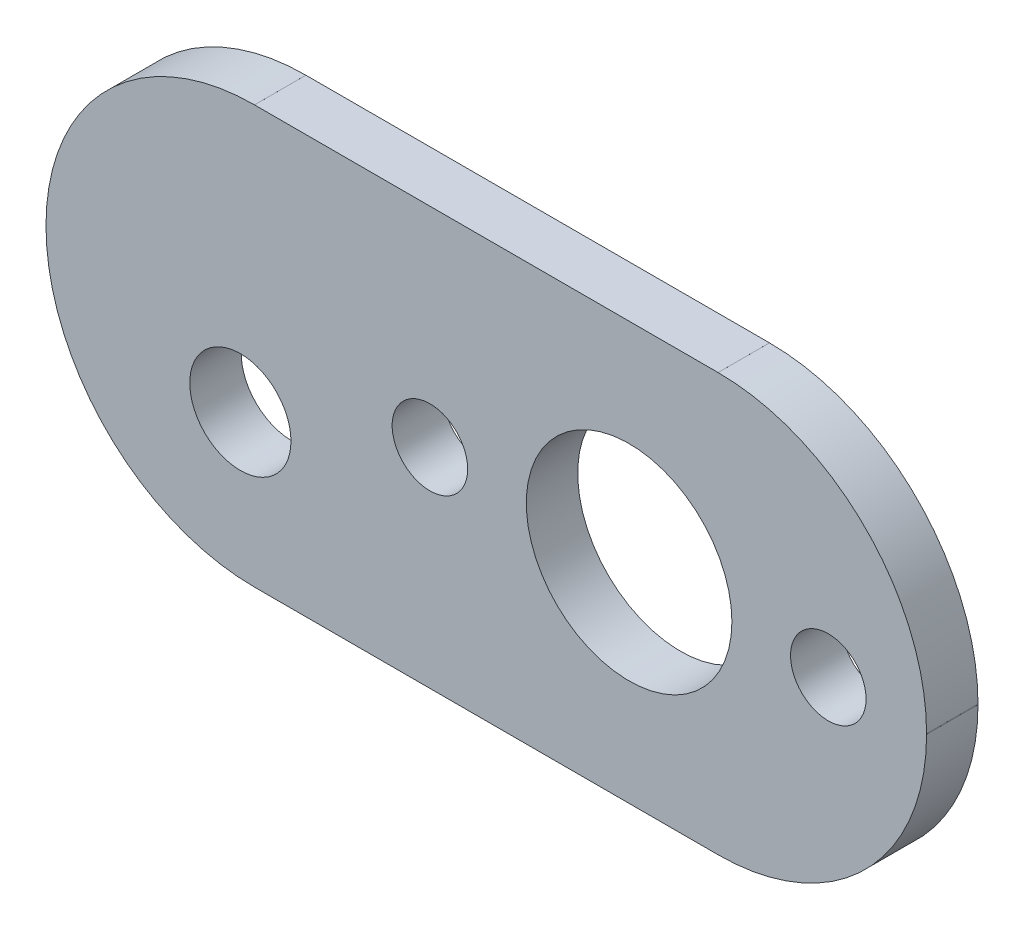
ISO-10303-21;
HEADER;
FILE_DESCRIPTION(('STEP AP214'),'2;1');
FILE_NAME('part.step','',(''),(''),'','','');
FILE_SCHEMA(('AUTOMOTIVE_DESIGN { 1 0 10303 214 1 1 1 1 }'));
ENDSEC;
DATA;
#1=APPLICATION_CONTEXT('core data for automotive mechanical design processes');
#2=APPLICATION_PROTOCOL_DEFINITION('international standard','automotive_design',2000,#1);
#3=PRODUCT_CONTEXT('',#1,'mechanical');
#4=PRODUCT('Part','Part','',(#3));
#5=PRODUCT_RELATED_PRODUCT_CATEGORY('part','',(#4));
#6=PRODUCT_DEFINITION_FORMATION('','',#4);
#7=PRODUCT_DEFINITION_CONTEXT('part definition',#1,'design');
#8=PRODUCT_DEFINITION('design','',#6,#7);
#9=PRODUCT_DEFINITION_SHAPE('','',#8);
#10=(LENGTH_UNIT() NAMED_UNIT(*) SI_UNIT(.MILLI.,.METRE.));
#11=(NAMED_UNIT(*) PLANE_ANGLE_UNIT() SI_UNIT($,.RADIAN.));
#12=(NAMED_UNIT(*) SI_UNIT($,.STERADIAN.) SOLID_ANGLE_UNIT());
#13=UNCERTAINTY_MEASURE_WITH_UNIT(LENGTH_MEASURE(1.E-05),#10,'distance_accuracy_value','');
#14=(GEOMETRIC_REPRESENTATION_CONTEXT(3) GLOBAL_UNCERTAINTY_ASSIGNED_CONTEXT((#13)) GLOBAL_UNIT_ASSIGNED_CONTEXT((#10,
#11,#12)) REPRESENTATION_CONTEXT('',''));
#15=CARTESIAN_POINT('',(0.,0.,0.));
#16=DIRECTION('',(0.,0.,1.));
#17=DIRECTION('',(1.,0.,0.));
#18=AXIS2_PLACEMENT_3D('',#15,#16,#17);
#19=CARTESIAN_POINT('',(-11.66,-6.5,1.6));
#20=DIRECTION('',(0.,0.,-1.));
#21=DIRECTION('',(-1.,0.,0.));
#22=AXIS2_PLACEMENT_3D('',#19,#20,#21);
#23=CYLINDRICAL_SURFACE('',#22,0.000300000000000387);
#24=CARTESIAN_POINT('',(-11.66,-6.5,0.));
#25=DIRECTION('',(0.,0.,1.));
#26=DIRECTION('',(1.,0.,0.));
#27=AXIS2_PLACEMENT_3D('',#24,#25,#26);
#28=CIRCLE('',#27,0.000300000000000387);
#29=CARTESIAN_POINT('',(-11.6597,-6.5,0.));
#30=VERTEX_POINT('',#29);
#31=CARTESIAN_POINT('',(-11.6603000000028,-6.49999998612066,0.));
#32=VERTEX_POINT('',#31);
#33=EDGE_CURVE('E204',#30,#32,#28,.T.);
#34=ORIENTED_EDGE('',*,*,#33,.F.);
#35=DIRECTION('',(0.,0.,-1.));
#36=VECTOR('',#35,1.);
#37=CARTESIAN_POINT('',(-11.6597,-6.5,1.6));
#38=LINE('',#37,#36);
#39=CARTESIAN_POINT('',(-11.6597,-6.5,1.6));
#40=VERTEX_POINT('',#39);
#41=EDGE_CURVE('E11',#40,#30,#38,.T.);
#42=ORIENTED_EDGE('',*,*,#41,.F.);
#43=CARTESIAN_POINT('',(-11.66,-6.5,1.6));
#44=DIRECTION('',(0.,0.,1.));
#45=DIRECTION('',(1.,0.,0.));
#46=AXIS2_PLACEMENT_3D('',#43,#44,#45);
#47=CIRCLE('',#46,0.000300000000000387);
#48=CARTESIAN_POINT('',(-11.6603000000028,-6.49999998612066,1.6));
#49=VERTEX_POINT('',#48);
#50=EDGE_CURVE('E334',#40,#49,#47,.T.);
#51=ORIENTED_EDGE('',*,*,#50,.T.);
#52=DIRECTION('',(0.,0.,-1.));
#53=VECTOR('',#52,1.);
#54=CARTESIAN_POINT('',(-11.6603000000028,-6.49999998612066,1.6));
#55=LINE('',#54,#53);
#56=EDGE_CURVE('E116',#49,#32,#55,.T.);
#57=ORIENTED_EDGE('',*,*,#56,.T.);
#58=EDGE_LOOP('',(#34,#42,#51,#57));
#59=FACE_BOUND('',#58,.T.);
#60=ADVANCED_FACE('F40',(#59),#23,.F.);
#61=CARTESIAN_POINT('',(0.,-6.5,1.6));
#62=DIRECTION('',(0.,1.,0.));
#63=DIRECTION('',(0.,0.,1.));
#64=AXIS2_PLACEMENT_3D('',#61,#62,#63);
#65=PLANE('',#64);
#66=DIRECTION('',(1.,0.,0.));
#67=VECTOR('',#66,1.);
#68=CARTESIAN_POINT('',(0.,-6.5,0.));
#69=LINE('',#68,#67);
#70=CARTESIAN_POINT('',(2.7697,-6.5,0.));
#71=VERTEX_POINT('',#70);
#72=EDGE_CURVE('E208',#30,#71,#69,.T.);
#73=ORIENTED_EDGE('',*,*,#72,.T.);
#74=DIRECTION('',(0.,0.,-1.));
#75=VECTOR('',#74,1.);
#76=CARTESIAN_POINT('',(2.7697,-6.5,1.6));
#77=LINE('',#76,#75);
#78=CARTESIAN_POINT('',(2.7697,-6.5,1.6));
#79=VERTEX_POINT('',#78);
#80=EDGE_CURVE('E50',#79,#71,#77,.T.);
#81=ORIENTED_EDGE('',*,*,#80,.F.);
#82=DIRECTION('',(1.,0.,0.));
#83=VECTOR('',#82,1.);
#84=CARTESIAN_POINT('',(0.,-6.5,1.6));
#85=LINE('',#84,#83);
#86=EDGE_CURVE('E330',#40,#79,#85,.T.);
#87=ORIENTED_EDGE('',*,*,#86,.F.);
#88=ORIENTED_EDGE('',*,*,#41,.T.);
#89=EDGE_LOOP('',(#73,#81,#87,#88));
#90=FACE_BOUND('',#89,.T.);
#91=ADVANCED_FACE('F314',(#90),#65,.F.);
#92=CARTESIAN_POINT('',(2.77,-6.5,1.6));
#93=DIRECTION('',(0.,0.,-1.));
#94=DIRECTION('',(-1.,0.,0.));
#95=AXIS2_PLACEMENT_3D('',#92,#93,#94);
#96=CYLINDRICAL_SURFACE('',#95,0.000300000000000387);
#97=CARTESIAN_POINT('',(2.77,-6.5,0.));
#98=DIRECTION('',(0.,0.,1.));
#99=DIRECTION('',(1.,0.,0.));
#100=AXIS2_PLACEMENT_3D('',#97,#98,#99);
#101=CIRCLE('',#100,0.000300000000000387);
#102=CARTESIAN_POINT('',(2.77030000000277,-6.49999998612066,0.));
#103=VERTEX_POINT('',#102);
#104=EDGE_CURVE('E212',#103,#71,#101,.T.);
#105=ORIENTED_EDGE('',*,*,#104,.F.);
#106=DIRECTION('',(0.,0.,-1.));
#107=VECTOR('',#106,1.);
#108=CARTESIAN_POINT('',(2.77030000000277,-6.49999998612066,1.6));
#109=LINE('',#108,#107);
#110=CARTESIAN_POINT('',(2.77030000000277,-6.49999998612066,1.6));
#111=VERTEX_POINT('',#110);
#112=EDGE_CURVE('E302',#111,#103,#109,.T.);
#113=ORIENTED_EDGE('',*,*,#112,.F.);
#114=CARTESIAN_POINT('',(2.77,-6.5,1.6));
#115=DIRECTION('',(0.,0.,1.));
#116=DIRECTION('',(1.,0.,0.));
#117=AXIS2_PLACEMENT_3D('',#114,#115,#116);
#118=CIRCLE('',#117,0.000300000000000387);
#119=EDGE_CURVE('E311',#111,#79,#118,.T.);
#120=ORIENTED_EDGE('',*,*,#119,.T.);
#121=ORIENTED_EDGE('',*,*,#80,.T.);
#122=EDGE_LOOP('',(#105,#113,#120,#121));
#123=FACE_BOUND('',#122,.T.);
#124=ADVANCED_FACE('F309',(#123),#96,.F.);
#125=CARTESIAN_POINT('',(2.76984973660068,-0.0098497366006773,1.6));
#126=DIRECTION('',(0.,0.,-1.));
#127=DIRECTION('',(-1.,0.,0.));
#128=AXIS2_PLACEMENT_3D('',#125,#126,#127);
#129=CYLINDRICAL_SURFACE('',#128,6.49015026513881);
#130=CARTESIAN_POINT('',(2.76984973660068,-0.0098497366006773,0.));
#131=DIRECTION('',(0.,0.,1.));
#132=DIRECTION('',(1.,0.,0.));
#133=AXIS2_PLACEMENT_3D('',#130,#131,#132);
#134=CIRCLE('',#133,6.49015026513881);
#135=CARTESIAN_POINT('',(9.2599999922879,-0.0101999999811796,0.));
#136=VERTEX_POINT('',#135);
#137=EDGE_CURVE('E216',#103,#136,#134,.T.);
#138=ORIENTED_EDGE('',*,*,#137,.T.);
#139=DIRECTION('',(0.,0.,-1.));
#140=VECTOR('',#139,1.);
#141=CARTESIAN_POINT('',(9.2599999922879,-0.0101999999811796,1.6));
#142=LINE('',#141,#140);
#143=CARTESIAN_POINT('',(9.2599999922879,-0.0101999999811796,1.6));
#144=VERTEX_POINT('',#143);
#145=EDGE_CURVE('E299',#144,#136,#142,.T.);
#146=ORIENTED_EDGE('',*,*,#145,.F.);
#147=CARTESIAN_POINT('',(2.76984973660068,-0.0098497366006773,1.6));
#148=DIRECTION('',(0.,0.,1.));
#149=DIRECTION('',(1.,0.,0.));
#150=AXIS2_PLACEMENT_3D('',#147,#148,#149);
#151=CIRCLE('',#150,6.49015026513881);
#152=EDGE_CURVE('E325',#111,#144,#151,.T.);
#153=ORIENTED_EDGE('',*,*,#152,.F.);
#154=ORIENTED_EDGE('',*,*,#112,.T.);
#155=EDGE_LOOP('',(#138,#146,#153,#154));
#156=FACE_BOUND('',#155,.T.);
#157=ADVANCED_FACE('F322',(#156),#129,.T.);
#158=CARTESIAN_POINT('',(9.26,-0.01,1.6));
#159=DIRECTION('',(0.,0.,-1.));
#160=DIRECTION('',(-1.,0.,0.));
#161=AXIS2_PLACEMENT_3D('',#158,#159,#160);
#162=CYLINDRICAL_SURFACE('',#161,0.00019999999999968);
#163=CARTESIAN_POINT('',(9.26,-0.01,0.));
#164=DIRECTION('',(0.,0.,1.));
#165=DIRECTION('',(1.,0.,0.));
#166=AXIS2_PLACEMENT_3D('',#163,#164,#165);
#167=CIRCLE('',#166,0.00019999999999968);
#168=CARTESIAN_POINT('',(9.26,-0.00980000000000032,0.));
#169=VERTEX_POINT('',#168);
#170=EDGE_CURVE('E220',#169,#136,#167,.T.);
#171=ORIENTED_EDGE('',*,*,#170,.F.);
#172=DIRECTION('',(0.,0.,-1.));
#173=VECTOR('',#172,1.);
#174=CARTESIAN_POINT('',(9.26,-0.00980000000000032,1.6));
#175=LINE('',#174,#173);
#176=CARTESIAN_POINT('',(9.26,-0.00980000000000032,1.6));
#177=VERTEX_POINT('',#176);
#178=EDGE_CURVE('E296',#177,#169,#175,.T.);
#179=ORIENTED_EDGE('',*,*,#178,.F.);
#180=CARTESIAN_POINT('',(9.26,-0.01,1.6));
#181=DIRECTION('',(0.,0.,1.));
#182=DIRECTION('',(1.,0.,0.));
#183=AXIS2_PLACEMENT_3D('',#180,#181,#182);
#184=CIRCLE('',#183,0.00019999999999968);
#185=EDGE_CURVE('E328',#177,#144,#184,.T.);
#186=ORIENTED_EDGE('',*,*,#185,.T.);
#187=ORIENTED_EDGE('',*,*,#145,.T.);
#188=EDGE_LOOP('',(#171,#179,#186,#187));
#189=FACE_BOUND('',#188,.T.);
#190=ADVANCED_FACE('F466',(#189),#162,.F.);
#191=CARTESIAN_POINT('',(9.26,-8.03176969377262E-13,1.6));
#192=DIRECTION('',(1.,0.,0.));
#193=DIRECTION('',(0.,1.,0.));
#194=AXIS2_PLACEMENT_3D('',#191,#192,#193);
#195=PLANE('',#194);
#196=DIRECTION('',(0.,-1.,0.));
#197=VECTOR('',#196,1.);
#198=CARTESIAN_POINT('',(9.26,-8.03176969377262E-13,0.));
#199=LINE('',#198,#197);
#200=CARTESIAN_POINT('',(9.26,0.00980000000000032,0.));
#201=VERTEX_POINT('',#200);
#202=EDGE_CURVE('E224',#201,#169,#199,.T.);
#203=ORIENTED_EDGE('',*,*,#202,.F.);
#204=DIRECTION('',(0.,0.,-1.));
#205=VECTOR('',#204,1.);
#206=CARTESIAN_POINT('',(9.26,0.00980000000000032,1.6));
#207=LINE('',#206,#205);
#208=CARTESIAN_POINT('',(9.26,0.00980000000000032,1.6));
#209=VERTEX_POINT('',#208);
#210=EDGE_CURVE('E293',#209,#201,#207,.T.);
#211=ORIENTED_EDGE('',*,*,#210,.F.);
#212=DIRECTION('',(0.,-1.,0.));
#213=VECTOR('',#212,1.);
#214=CARTESIAN_POINT('',(9.26,-8.03176969377262E-13,1.6));
#215=LINE('',#214,#213);
#216=EDGE_CURVE('E340',#209,#177,#215,.T.);
#217=ORIENTED_EDGE('',*,*,#216,.T.);
#218=ORIENTED_EDGE('',*,*,#178,.T.);
#219=EDGE_LOOP('',(#203,#211,#217,#218));
#220=FACE_BOUND('',#219,.T.);
#221=ADVANCED_FACE('F462',(#220),#195,.T.);
#222=CARTESIAN_POINT('',(9.26,0.01,1.6));
#223=DIRECTION('',(0.,0.,-1.));
#224=DIRECTION('',(-1.,0.,0.));
#225=AXIS2_PLACEMENT_3D('',#222,#223,#224);
#226=CYLINDRICAL_SURFACE('',#225,0.00019999999999968);
#227=CARTESIAN_POINT('',(9.26,0.01,0.));
#228=DIRECTION('',(0.,0.,1.));
#229=DIRECTION('',(1.,0.,0.));
#230=AXIS2_PLACEMENT_3D('',#227,#228,#229);
#231=CIRCLE('',#230,0.00019999999999968);
#232=CARTESIAN_POINT('',(9.2599999922879,0.010199999999851,0.));
#233=VERTEX_POINT('',#232);
#234=EDGE_CURVE('E228',#233,#201,#231,.T.);
#235=ORIENTED_EDGE('',*,*,#234,.F.);
#236=DIRECTION('',(0.,0.,-1.));
#237=VECTOR('',#236,1.);
#238=CARTESIAN_POINT('',(9.2599999922879,0.010199999999851,1.6));
#239=LINE('',#238,#237);
#240=CARTESIAN_POINT('',(9.2599999922879,0.010199999999851,1.6));
#241=VERTEX_POINT('',#240);
#242=EDGE_CURVE('E290',#241,#233,#239,.T.);
#243=ORIENTED_EDGE('',*,*,#242,.F.);
#244=CARTESIAN_POINT('',(9.26,0.01,1.6));
#245=DIRECTION('',(0.,0.,1.));
#246=DIRECTION('',(1.,0.,0.));
#247=AXIS2_PLACEMENT_3D('',#244,#245,#246);
#248=CIRCLE('',#247,0.00019999999999968);
#249=EDGE_CURVE('E344',#241,#209,#248,.T.);
#250=ORIENTED_EDGE('',*,*,#249,.T.);
#251=ORIENTED_EDGE('',*,*,#210,.T.);
#252=EDGE_LOOP('',(#235,#243,#250,#251));
#253=FACE_BOUND('',#252,.T.);
#254=ADVANCED_FACE('F458',(#253),#226,.F.);
#255=CARTESIAN_POINT('',(2.76984973660068,0.00984973660067773,1.6));
#256=DIRECTION('',(0.,0.,-1.));
#257=DIRECTION('',(-1.,0.,0.));
#258=AXIS2_PLACEMENT_3D('',#255,#256,#257);
#259=CYLINDRICAL_SURFACE('',#258,6.49015026513881);
#260=CARTESIAN_POINT('',(2.76984973660068,0.00984973660067773,0.));
#261=DIRECTION('',(0.,0.,1.));
#262=DIRECTION('',(1.,0.,0.));
#263=AXIS2_PLACEMENT_3D('',#260,#261,#262);
#264=CIRCLE('',#263,6.49015026513881);
#265=CARTESIAN_POINT('',(2.77029999998019,6.49999998612066,0.));
#266=VERTEX_POINT('',#265);
#267=EDGE_CURVE('E232',#233,#266,#264,.T.);
#268=ORIENTED_EDGE('',*,*,#267,.T.);
#269=DIRECTION('',(0.,0.,-1.));
#270=VECTOR('',#269,1.);
#271=CARTESIAN_POINT('',(2.77029999998019,6.49999998612066,1.6));
#272=LINE('',#271,#270);
#273=CARTESIAN_POINT('',(2.77029999998019,6.49999998612066,1.6));
#274=VERTEX_POINT('',#273);
#275=EDGE_CURVE('E287',#274,#266,#272,.T.);
#276=ORIENTED_EDGE('',*,*,#275,.F.);
#277=CARTESIAN_POINT('',(2.76984973660068,0.00984973660067773,1.6));
#278=DIRECTION('',(0.,0.,1.));
#279=DIRECTION('',(1.,0.,0.));
#280=AXIS2_PLACEMENT_3D('',#277,#278,#279);
#281=CIRCLE('',#280,6.49015026513881);
#282=EDGE_CURVE('E348',#241,#274,#281,.T.);
#283=ORIENTED_EDGE('',*,*,#282,.F.);
#284=ORIENTED_EDGE('',*,*,#242,.T.);
#285=EDGE_LOOP('',(#268,#276,#283,#284));
#286=FACE_BOUND('',#285,.T.);
#287=ADVANCED_FACE('F454',(#286),#259,.T.);
#288=CARTESIAN_POINT('',(2.77,6.5,1.6));
#289=DIRECTION('',(0.,0.,-1.));
#290=DIRECTION('',(-1.,0.,0.));
#291=AXIS2_PLACEMENT_3D('',#288,#289,#290);
#292=CYLINDRICAL_SURFACE('',#291,0.000300000000000387);
#293=CARTESIAN_POINT('',(2.77,6.5,0.));
#294=DIRECTION('',(0.,0.,1.));
#295=DIRECTION('',(1.,0.,0.));
#296=AXIS2_PLACEMENT_3D('',#293,#294,#295);
#297=CIRCLE('',#296,0.000300000000000387);
#298=CARTESIAN_POINT('',(2.7697,6.5,0.));
#299=VERTEX_POINT('',#298);
#300=EDGE_CURVE('E236',#299,#266,#297,.T.);
#301=ORIENTED_EDGE('',*,*,#300,.F.);
#302=DIRECTION('',(0.,0.,-1.));
#303=VECTOR('',#302,1.);
#304=CARTESIAN_POINT('',(2.7697,6.5,1.6));
#305=LINE('',#304,#303);
#306=CARTESIAN_POINT('',(2.7697,6.5,1.6));
#307=VERTEX_POINT('',#306);
#308=EDGE_CURVE('E284',#307,#299,#305,.T.);
#309=ORIENTED_EDGE('',*,*,#308,.F.);
#310=CARTESIAN_POINT('',(2.77,6.5,1.6));
#311=DIRECTION('',(0.,0.,1.));
#312=DIRECTION('',(1.,0.,0.));
#313=AXIS2_PLACEMENT_3D('',#310,#311,#312);
#314=CIRCLE('',#313,0.000300000000000387);
#315=EDGE_CURVE('E351',#307,#274,#314,.T.);
#316=ORIENTED_EDGE('',*,*,#315,.T.);
#317=ORIENTED_EDGE('',*,*,#275,.T.);
#318=EDGE_LOOP('',(#301,#309,#316,#317));
#319=FACE_BOUND('',#318,.T.);
#320=ADVANCED_FACE('F450',(#319),#292,.F.);
#321=CARTESIAN_POINT('',(0.,6.5,1.6));
#322=DIRECTION('',(0.,-1.,0.));
#323=DIRECTION('',(0.,0.,-1.));
#324=AXIS2_PLACEMENT_3D('',#321,#322,#323);
#325=PLANE('',#324);
#326=DIRECTION('',(-1.,0.,0.));
#327=VECTOR('',#326,1.);
#328=CARTESIAN_POINT('',(0.,6.5,0.));
#329=LINE('',#328,#327);
#330=CARTESIAN_POINT('',(-11.6597,6.5,0.));
#331=VERTEX_POINT('',#330);
#332=EDGE_CURVE('E240',#299,#331,#329,.T.);
#333=ORIENTED_EDGE('',*,*,#332,.T.);
#334=DIRECTION('',(0.,0.,-1.));
#335=VECTOR('',#334,1.);
#336=CARTESIAN_POINT('',(-11.6597,6.5,1.6));
#337=LINE('',#336,#335);
#338=CARTESIAN_POINT('',(-11.6597,6.5,1.6));
#339=VERTEX_POINT('',#338);
#340=EDGE_CURVE('E281',#339,#331,#337,.T.);
#341=ORIENTED_EDGE('',*,*,#340,.F.);
#342=DIRECTION('',(-1.,0.,0.));
#343=VECTOR('',#342,1.);
#344=CARTESIAN_POINT('',(0.,6.5,1.6));
#345=LINE('',#344,#343);
#346=EDGE_CURVE('E355',#307,#339,#345,.T.);
#347=ORIENTED_EDGE('',*,*,#346,.F.);
#348=ORIENTED_EDGE('',*,*,#308,.T.);
#349=EDGE_LOOP('',(#333,#341,#347,#348));
#350=FACE_BOUND('',#349,.T.);
#351=ADVANCED_FACE('F446',(#350),#325,.F.);
#352=CARTESIAN_POINT('',(-11.66,6.5,1.6));
#353=DIRECTION('',(0.,0.,-1.));
#354=DIRECTION('',(-1.,0.,0.));
#355=AXIS2_PLACEMENT_3D('',#352,#353,#354);
#356=CYLINDRICAL_SURFACE('',#355,0.000300000000000387);
#357=CARTESIAN_POINT('',(-11.66,6.5,0.));
#358=DIRECTION('',(0.,0.,1.));
#359=DIRECTION('',(1.,0.,0.));
#360=AXIS2_PLACEMENT_3D('',#357,#358,#359);
#361=CIRCLE('',#360,0.000300000000000387);
#362=CARTESIAN_POINT('',(-11.6602999999997,6.49999998612066,0.));
#363=VERTEX_POINT('',#362);
#364=EDGE_CURVE('E244',#363,#331,#361,.T.);
#365=ORIENTED_EDGE('',*,*,#364,.F.);
#366=DIRECTION('',(0.,0.,-1.));
#367=VECTOR('',#366,1.);
#368=CARTESIAN_POINT('',(-11.6602999999997,6.49999998612066,1.6));
#369=LINE('',#368,#367);
#370=CARTESIAN_POINT('',(-11.6602999999997,6.49999998612066,1.6));
#371=VERTEX_POINT('',#370);
#372=EDGE_CURVE('E278',#371,#363,#369,.T.);
#373=ORIENTED_EDGE('',*,*,#372,.F.);
#374=CARTESIAN_POINT('',(-11.66,6.5,1.6));
#375=DIRECTION('',(0.,0.,1.));
#376=DIRECTION('',(1.,0.,0.));
#377=AXIS2_PLACEMENT_3D('',#374,#375,#376);
#378=CIRCLE('',#377,0.000300000000000387);
#379=EDGE_CURVE('E358',#371,#339,#378,.T.);
#380=ORIENTED_EDGE('',*,*,#379,.T.);
#381=ORIENTED_EDGE('',*,*,#340,.T.);
#382=EDGE_LOOP('',(#365,#373,#380,#381));
#383=FACE_BOUND('',#382,.T.);
#384=ADVANCED_FACE('F442',(#383),#356,.F.);
#385=CARTESIAN_POINT('',(-11.6598497366007,0.0098497366006773,1.6));
#386=DIRECTION('',(0.,0.,-1.));
#387=DIRECTION('',(-1.,0.,0.));
#388=AXIS2_PLACEMENT_3D('',#385,#386,#387);
#389=CYLINDRICAL_SURFACE('',#388,6.49015026513881);
#390=CARTESIAN_POINT('',(-11.6598497366007,0.0098497366006773,0.));
#391=DIRECTION('',(0.,0.,1.));
#392=DIRECTION('',(1.,0.,0.));
#393=AXIS2_PLACEMENT_3D('',#390,#391,#392);
#394=CIRCLE('',#393,6.49015026513881);
#395=CARTESIAN_POINT('',(-18.1499999897066,0.0102449468599297,0.));
#396=VERTEX_POINT('',#395);
#397=EDGE_CURVE('E248',#363,#396,#394,.T.);
#398=ORIENTED_EDGE('',*,*,#397,.T.);
#399=DIRECTION('',(0.,0.,-1.));
#400=VECTOR('',#399,1.);
#401=CARTESIAN_POINT('',(-18.1499999897066,0.0102449468599297,1.6));
#402=LINE('',#401,#400);
#403=CARTESIAN_POINT('',(-18.1499999897066,0.0102449468599297,1.6));
#404=VERTEX_POINT('',#403);
#405=EDGE_CURVE('E275',#404,#396,#402,.T.);
#406=ORIENTED_EDGE('',*,*,#405,.F.);
#407=CARTESIAN_POINT('',(-11.6598497366007,0.0098497366006773,1.6));
#408=DIRECTION('',(0.,0.,1.));
#409=DIRECTION('',(1.,0.,0.));
#410=AXIS2_PLACEMENT_3D('',#407,#408,#409);
#411=CIRCLE('',#410,6.49015026513881);
#412=EDGE_CURVE('E362',#371,#404,#411,.T.);
#413=ORIENTED_EDGE('',*,*,#412,.F.);
#414=ORIENTED_EDGE('',*,*,#372,.T.);
#415=EDGE_LOOP('',(#398,#406,#413,#414));
#416=FACE_BOUND('',#415,.T.);
#417=ADVANCED_FACE('F439',(#416),#389,.T.);
#418=CARTESIAN_POINT('',(-18.15005,0.01,1.6));
#419=DIRECTION('',(0.,0.,-1.));
#420=DIRECTION('',(-1.,0.,0.));
#421=AXIS2_PLACEMENT_3D('',#418,#419,#420);
#422=CYLINDRICAL_SURFACE('',#421,0.00025000000000025);
#423=CARTESIAN_POINT('',(-18.15005,0.01,0.));
#424=DIRECTION('',(0.,0.,1.));
#425=DIRECTION('',(1.,0.,0.));
#426=AXIS2_PLACEMENT_3D('',#423,#424,#425);
#427=CIRCLE('',#426,0.00025000000000025);
#428=CARTESIAN_POINT('',(-18.15,0.00975505102572172,0.));
#429=VERTEX_POINT('',#428);
#430=EDGE_CURVE('E252',#429,#396,#427,.T.);
#431=ORIENTED_EDGE('',*,*,#430,.F.);
#432=DIRECTION('',(0.,0.,-1.));
#433=VECTOR('',#432,1.);
#434=CARTESIAN_POINT('',(-18.15,0.00975505102572172,1.6));
#435=LINE('',#434,#433);
#436=CARTESIAN_POINT('',(-18.15,0.00975505102572172,1.6));
#437=VERTEX_POINT('',#436);
#438=EDGE_CURVE('E179',#437,#429,#435,.T.);
#439=ORIENTED_EDGE('',*,*,#438,.F.);
#440=CARTESIAN_POINT('',(-18.15005,0.01,1.6));
#441=DIRECTION('',(0.,0.,1.));
#442=DIRECTION('',(1.,0.,0.));
#443=AXIS2_PLACEMENT_3D('',#440,#441,#442);
#444=CIRCLE('',#443,0.00025000000000025);
#445=EDGE_CURVE('E166',#437,#404,#444,.T.);
#446=ORIENTED_EDGE('',*,*,#445,.T.);
#447=ORIENTED_EDGE('',*,*,#405,.T.);
#448=EDGE_LOOP('',(#431,#439,#446,#447));
#449=FACE_BOUND('',#448,.T.);
#450=ADVANCED_FACE('F367',(#449),#422,.F.);
#451=CARTESIAN_POINT('',(-18.15,0.,1.6));
#452=DIRECTION('',(1.,0.,0.));
#453=DIRECTION('',(0.,0.,-1.));
#454=AXIS2_PLACEMENT_3D('',#451,#452,#453);
#455=PLANE('',#454);
#456=DIRECTION('',(0.,-1.,0.));
#457=VECTOR('',#456,1.);
#458=CARTESIAN_POINT('',(-18.15,0.,0.));
#459=LINE('',#458,#457);
#460=CARTESIAN_POINT('',(-18.15,-0.00975505102572172,0.));
#461=VERTEX_POINT('',#460);
#462=EDGE_CURVE('E174',#429,#461,#459,.T.);
#463=ORIENTED_EDGE('',*,*,#462,.T.);
#464=DIRECTION('',(0.,0.,-1.));
#465=VECTOR('',#464,1.);
#466=CARTESIAN_POINT('',(-18.15,-0.00975505102572172,1.6));
#467=LINE('',#466,#465);
#468=CARTESIAN_POINT('',(-18.15,-0.00975505102572172,1.6));
#469=VERTEX_POINT('',#468);
#470=EDGE_CURVE('E171',#469,#461,#467,.T.);
#471=ORIENTED_EDGE('',*,*,#470,.F.);
#472=DIRECTION('',(0.,-1.,0.));
#473=VECTOR('',#472,1.);
#474=CARTESIAN_POINT('',(-18.15,0.,1.6));
#475=LINE('',#474,#473);
#476=EDGE_CURVE('E159',#437,#469,#475,.T.);
#477=ORIENTED_EDGE('',*,*,#476,.F.);
#478=ORIENTED_EDGE('',*,*,#438,.T.);
#479=EDGE_LOOP('',(#463,#471,#477,#478));
#480=FACE_BOUND('',#479,.T.);
#481=ADVANCED_FACE('F172',(#480),#455,.F.);
#482=CARTESIAN_POINT('',(-18.15005,-0.01,1.6));
#483=DIRECTION('',(0.,0.,-1.));
#484=DIRECTION('',(-1.,0.,0.));
#485=AXIS2_PLACEMENT_3D('',#482,#483,#484);
#486=CYLINDRICAL_SURFACE('',#485,0.00025000000000025);
#487=CARTESIAN_POINT('',(-18.15005,-0.01,0.));
#488=DIRECTION('',(0.,0.,1.));
#489=DIRECTION('',(1.,0.,0.));
#490=AXIS2_PLACEMENT_3D('',#487,#488,#489);
#491=CIRCLE('',#490,0.00025000000000025);
#492=CARTESIAN_POINT('',(-18.1499999897066,-0.0102449468729113,0.));
#493=VERTEX_POINT('',#492);
#494=EDGE_CURVE('E258',#493,#461,#491,.T.);
#495=ORIENTED_EDGE('',*,*,#494,.F.);
#496=DIRECTION('',(0.,0.,-1.));
#497=VECTOR('',#496,1.);
#498=CARTESIAN_POINT('',(-18.1499999897066,-0.0102449468729113,1.6));
#499=LINE('',#498,#497);
#500=CARTESIAN_POINT('',(-18.1499999897066,-0.0102449468729113,1.6));
#501=VERTEX_POINT('',#500);
#502=EDGE_CURVE('E109',#501,#493,#499,.T.);
#503=ORIENTED_EDGE('',*,*,#502,.F.);
#504=CARTESIAN_POINT('',(-18.15005,-0.01,1.6));
#505=DIRECTION('',(0.,0.,1.));
#506=DIRECTION('',(1.,0.,0.));
#507=AXIS2_PLACEMENT_3D('',#504,#505,#506);
#508=CIRCLE('',#507,0.00025000000000025);
#509=EDGE_CURVE('E164',#501,#469,#508,.T.);
#510=ORIENTED_EDGE('',*,*,#509,.T.);
#511=ORIENTED_EDGE('',*,*,#470,.T.);
#512=EDGE_LOOP('',(#495,#503,#510,#511));
#513=FACE_BOUND('',#512,.T.);
#514=ADVANCED_FACE('F181',(#513),#486,.F.);
#515=CARTESIAN_POINT('',(-11.6598497366007,-0.00984973660067773,1.6));
#516=DIRECTION('',(0.,0.,-1.));
#517=DIRECTION('',(-1.,0.,0.));
#518=AXIS2_PLACEMENT_3D('',#515,#516,#517);
#519=CYLINDRICAL_SURFACE('',#518,6.49015026513881);
#520=CARTESIAN_POINT('',(-11.6598497366007,-0.00984973660067773,0.));
#521=DIRECTION('',(0.,0.,1.));
#522=DIRECTION('',(1.,0.,0.));
#523=AXIS2_PLACEMENT_3D('',#520,#521,#522);
#524=CIRCLE('',#523,6.49015026513881);
#525=EDGE_CURVE('E261',#493,#32,#524,.T.);
#526=ORIENTED_EDGE('',*,*,#525,.T.);
#527=ORIENTED_EDGE('',*,*,#56,.F.);
#528=CARTESIAN_POINT('',(-11.6598497366007,-0.00984973660067773,1.6));
#529=DIRECTION('',(0.,0.,1.));
#530=DIRECTION('',(1.,0.,0.));
#531=AXIS2_PLACEMENT_3D('',#528,#529,#530);
#532=CIRCLE('',#531,6.49015026513881);
#533=EDGE_CURVE('E58',#501,#49,#532,.T.);
#534=ORIENTED_EDGE('',*,*,#533,.F.);
#535=ORIENTED_EDGE('',*,*,#502,.T.);
#536=EDGE_LOOP('',(#526,#527,#534,#535));
#537=FACE_BOUND('',#536,.T.);
#538=ADVANCED_FACE('F370',(#537),#519,.T.);
#539=CARTESIAN_POINT('',(0.,0.,1.6));
#540=DIRECTION('',(0.,0.,-1.));
#541=DIRECTION('',(-1.,0.,0.));
#542=AXIS2_PLACEMENT_3D('',#539,#540,#541);
#543=CYLINDRICAL_SURFACE('',#542,3.2);
#544=CARTESIAN_POINT('',(0.,0.,1.6));
#545=DIRECTION('',(0.,0.,1.));
#546=DIRECTION('',(1.,0.,0.));
#547=AXIS2_PLACEMENT_3D('',#544,#545,#546);
#548=CIRCLE('',#547,3.2);
#549=CARTESIAN_POINT('',(3.2,0.,1.6));
#550=VERTEX_POINT('',#549);
#551=EDGE_CURVE('E372',#550,#550,#548,.T.);
#552=ORIENTED_EDGE('',*,*,#551,.T.);
#553=EDGE_LOOP('',(#552));
#554=FACE_BOUND('',#553,.T.);
#555=CARTESIAN_POINT('',(0.,0.,0.));
#556=DIRECTION('',(0.,0.,1.));
#557=DIRECTION('',(1.,0.,0.));
#558=AXIS2_PLACEMENT_3D('',#555,#556,#557);
#559=CIRCLE('',#558,3.2);
#560=CARTESIAN_POINT('',(3.2,0.,0.));
#561=VERTEX_POINT('',#560);
#562=EDGE_CURVE('E200',#561,#561,#559,.T.);
#563=ORIENTED_EDGE('',*,*,#562,.F.);
#564=EDGE_LOOP('',(#563));
#565=FACE_BOUND('',#564,.T.);
#566=ADVANCED_FACE('F395',(#554,#565),#543,.F.);
#567=CARTESIAN_POINT('',(-6.2,0.,1.6));
#568=DIRECTION('',(0.,0.,-1.));
#569=DIRECTION('',(-1.,0.,0.));
#570=AXIS2_PLACEMENT_3D('',#567,#568,#569);
#571=CYLINDRICAL_SURFACE('',#570,1.175);
#572=CARTESIAN_POINT('',(-6.2,0.,1.6));
#573=DIRECTION('',(0.,0.,1.));
#574=DIRECTION('',(1.,0.,0.));
#575=AXIS2_PLACEMENT_3D('',#572,#573,#574);
#576=CIRCLE('',#575,1.175);
#577=CARTESIAN_POINT('',(-5.025,0.,1.6));
#578=VERTEX_POINT('',#577);
#579=EDGE_CURVE('E375',#578,#578,#576,.T.);
#580=ORIENTED_EDGE('',*,*,#579,.T.);
#581=EDGE_LOOP('',(#580));
#582=FACE_BOUND('',#581,.T.);
#583=CARTESIAN_POINT('',(-6.2,0.,0.));
#584=DIRECTION('',(0.,0.,1.));
#585=DIRECTION('',(1.,0.,0.));
#586=AXIS2_PLACEMENT_3D('',#583,#584,#585);
#587=CIRCLE('',#586,1.175);
#588=CARTESIAN_POINT('',(-5.025,0.,0.));
#589=VERTEX_POINT('',#588);
#590=EDGE_CURVE('E196',#589,#589,#587,.T.);
#591=ORIENTED_EDGE('',*,*,#590,.F.);
#592=EDGE_LOOP('',(#591));
#593=FACE_BOUND('',#592,.T.);
#594=ADVANCED_FACE('F398',(#582,#593),#571,.F.);
#595=CARTESIAN_POINT('',(6.2,0.,1.6));
#596=DIRECTION('',(0.,0.,-1.));
#597=DIRECTION('',(-1.,0.,0.));
#598=AXIS2_PLACEMENT_3D('',#595,#596,#597);
#599=CYLINDRICAL_SURFACE('',#598,1.175);
#600=CARTESIAN_POINT('',(6.2,0.,1.6));
#601=DIRECTION('',(0.,0.,1.));
#602=DIRECTION('',(1.,0.,0.));
#603=AXIS2_PLACEMENT_3D('',#600,#601,#602);
#604=CIRCLE('',#603,1.175);
#605=CARTESIAN_POINT('',(7.375,0.,1.6));
#606=VERTEX_POINT('',#605);
#607=EDGE_CURVE('E268',#606,#606,#604,.T.);
#608=ORIENTED_EDGE('',*,*,#607,.T.);
#609=EDGE_LOOP('',(#608));
#610=FACE_BOUND('',#609,.T.);
#611=CARTESIAN_POINT('',(6.2,0.,0.));
#612=DIRECTION('',(0.,0.,1.));
#613=DIRECTION('',(1.,0.,0.));
#614=AXIS2_PLACEMENT_3D('',#611,#612,#613);
#615=CIRCLE('',#614,1.175);
#616=CARTESIAN_POINT('',(7.375,0.,0.));
#617=VERTEX_POINT('',#616);
#618=EDGE_CURVE('E192',#617,#617,#615,.T.);
#619=ORIENTED_EDGE('',*,*,#618,.F.);
#620=EDGE_LOOP('',(#619));
#621=FACE_BOUND('',#620,.T.);
#622=ADVANCED_FACE('F42',(#610,#621),#599,.F.);
#623=CARTESIAN_POINT('',(-12.1,-2.,1.6));
#624=DIRECTION('',(0.,0.,-1.));
#625=DIRECTION('',(-1.,0.,0.));
#626=AXIS2_PLACEMENT_3D('',#623,#624,#625);
#627=CYLINDRICAL_SURFACE('',#626,1.575);
#628=CARTESIAN_POINT('',(-12.1,-2.,1.6));
#629=DIRECTION('',(0.,0.,1.));
#630=DIRECTION('',(1.,0.,0.));
#631=AXIS2_PLACEMENT_3D('',#628,#629,#630);
#632=CIRCLE('',#631,1.575);
#633=CARTESIAN_POINT('',(-10.525,-2.,1.6));
#634=VERTEX_POINT('',#633);
#635=EDGE_CURVE('E185',#634,#634,#632,.T.);
#636=ORIENTED_EDGE('',*,*,#635,.T.);
#637=EDGE_LOOP('',(#636));
#638=FACE_BOUND('',#637,.T.);
#639=CARTESIAN_POINT('',(-12.1,-2.,0.));
#640=DIRECTION('',(0.,0.,1.));
#641=DIRECTION('',(1.,0.,0.));
#642=AXIS2_PLACEMENT_3D('',#639,#640,#641);
#643=CIRCLE('',#642,1.575);
#644=CARTESIAN_POINT('',(-10.525,-2.,0.));
#645=VERTEX_POINT('',#644);
#646=EDGE_CURVE('E264',#645,#645,#643,.T.);
#647=ORIENTED_EDGE('',*,*,#646,.F.);
#648=EDGE_LOOP('',(#647));
#649=FACE_BOUND('',#648,.T.);
#650=ADVANCED_FACE('F389',(#638,#649),#627,.F.);
#651=CARTESIAN_POINT('',(0.,0.,1.6));
#652=DIRECTION('',(0.,0.,1.));
#653=DIRECTION('',(1.,0.,0.));
#654=AXIS2_PLACEMENT_3D('',#651,#652,#653);
#655=PLANE('',#654);
#656=ORIENTED_EDGE('',*,*,#607,.F.);
#657=EDGE_LOOP('',(#656));
#658=FACE_BOUND('',#657,.T.);
#659=ORIENTED_EDGE('',*,*,#579,.F.);
#660=EDGE_LOOP('',(#659));
#661=FACE_BOUND('',#660,.T.);
#662=ORIENTED_EDGE('',*,*,#551,.F.);
#663=EDGE_LOOP('',(#662));
#664=FACE_BOUND('',#663,.T.);
#665=ORIENTED_EDGE('',*,*,#50,.F.);
#666=ORIENTED_EDGE('',*,*,#86,.T.);
#667=ORIENTED_EDGE('',*,*,#119,.F.);
#668=ORIENTED_EDGE('',*,*,#152,.T.);
#669=ORIENTED_EDGE('',*,*,#185,.F.);
#670=ORIENTED_EDGE('',*,*,#216,.F.);
#671=ORIENTED_EDGE('',*,*,#249,.F.);
#672=ORIENTED_EDGE('',*,*,#282,.T.);
#673=ORIENTED_EDGE('',*,*,#315,.F.);
#674=ORIENTED_EDGE('',*,*,#346,.T.);
#675=ORIENTED_EDGE('',*,*,#379,.F.);
#676=ORIENTED_EDGE('',*,*,#412,.T.);
#677=ORIENTED_EDGE('',*,*,#445,.F.);
#678=ORIENTED_EDGE('',*,*,#476,.T.);
#679=ORIENTED_EDGE('',*,*,#509,.F.);
#680=ORIENTED_EDGE('',*,*,#533,.T.);
#681=EDGE_LOOP('',(#665,#666,#667,#668,#669,#670,#671,#672,#673,#674,#675,#676,#677,#678,#679,#680));
#682=FACE_BOUND('',#681,.T.);
#683=ORIENTED_EDGE('',*,*,#635,.F.);
#684=EDGE_LOOP('',(#683));
#685=FACE_BOUND('',#684,.T.);
#686=ADVANCED_FACE('F161',(#658,#661,#664,#682,#685),#655,.T.);
#687=CARTESIAN_POINT('',(0.,0.,0.));
#688=DIRECTION('',(0.,0.,1.));
#689=DIRECTION('',(1.,0.,0.));
#690=AXIS2_PLACEMENT_3D('',#687,#688,#689);
#691=PLANE('',#690);
#692=ORIENTED_EDGE('',*,*,#618,.T.);
#693=EDGE_LOOP('',(#692));
#694=FACE_BOUND('',#693,.T.);
#695=ORIENTED_EDGE('',*,*,#590,.T.);
#696=EDGE_LOOP('',(#695));
#697=FACE_BOUND('',#696,.T.);
#698=ORIENTED_EDGE('',*,*,#562,.T.);
#699=EDGE_LOOP('',(#698));
#700=FACE_BOUND('',#699,.T.);
#701=ORIENTED_EDGE('',*,*,#33,.T.);
#702=ORIENTED_EDGE('',*,*,#525,.F.);
#703=ORIENTED_EDGE('',*,*,#494,.T.);
#704=ORIENTED_EDGE('',*,*,#462,.F.);
#705=ORIENTED_EDGE('',*,*,#430,.T.);
#706=ORIENTED_EDGE('',*,*,#397,.F.);
#707=ORIENTED_EDGE('',*,*,#364,.T.);
#708=ORIENTED_EDGE('',*,*,#332,.F.);
#709=ORIENTED_EDGE('',*,*,#300,.T.);
#710=ORIENTED_EDGE('',*,*,#267,.F.);
#711=ORIENTED_EDGE('',*,*,#234,.T.);
#712=ORIENTED_EDGE('',*,*,#202,.T.);
#713=ORIENTED_EDGE('',*,*,#170,.T.);
#714=ORIENTED_EDGE('',*,*,#137,.F.);
#715=ORIENTED_EDGE('',*,*,#104,.T.);
#716=ORIENTED_EDGE('',*,*,#72,.F.);
#717=EDGE_LOOP('',(#701,#702,#703,#704,#705,#706,#707,#708,#709,#710,#711,#712,#713,#714,#715,#716));
#718=FACE_BOUND('',#717,.T.);
#719=ORIENTED_EDGE('',*,*,#646,.T.);
#720=EDGE_LOOP('',(#719));
#721=FACE_BOUND('',#720,.T.);
#722=ADVANCED_FACE('F317',(#694,#697,#700,#718,#721),#691,.F.);
#723=CLOSED_SHELL('',(#60,#91,#124,#157,#190,#221,#254,#287,#320,#351,#384,#417,#450,#481,#514,
#538,#566,#594,#622,#650,#686,#722));
#724=MANIFOLD_SOLID_BREP('B2',#723);
#725=ADVANCED_BREP_SHAPE_REPRESENTATION('',(#18,#724),#14);
#726=SHAPE_DEFINITION_REPRESENTATION(#9,#725);
ENDSEC;
END-ISO-10303-21;
